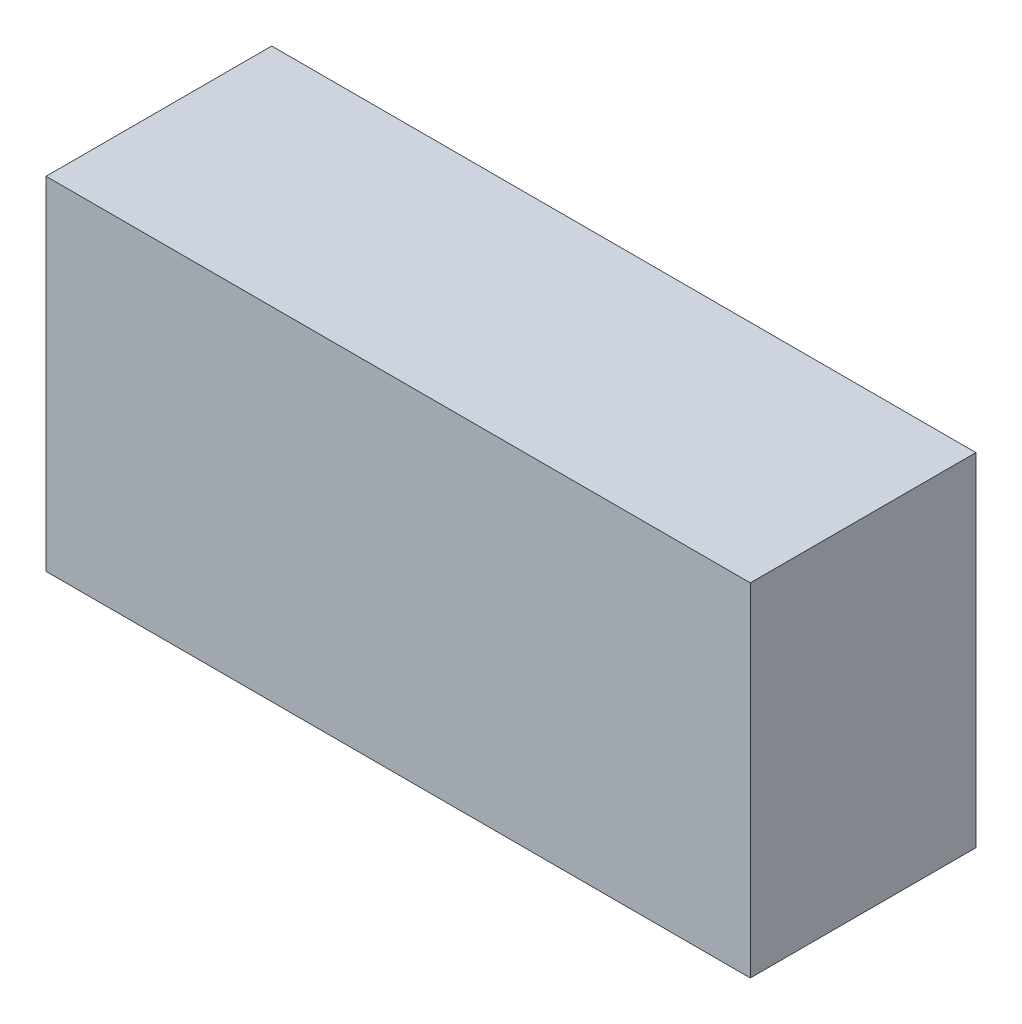
ISO-10303-21;
HEADER;
FILE_DESCRIPTION(('STEP AP214'),'2;1');
FILE_NAME('part.step','',(''),(''),'','','');
FILE_SCHEMA(('AUTOMOTIVE_DESIGN { 1 0 10303 214 1 1 1 1 }'));
ENDSEC;
DATA;
#1=APPLICATION_CONTEXT('core data for automotive mechanical design processes');
#2=APPLICATION_PROTOCOL_DEFINITION('international standard','automotive_design',2000,#1);
#3=PRODUCT_CONTEXT('',#1,'mechanical');
#4=PRODUCT('Part','Part','',(#3));
#5=PRODUCT_RELATED_PRODUCT_CATEGORY('part','',(#4));
#6=PRODUCT_DEFINITION_FORMATION('','',#4);
#7=PRODUCT_DEFINITION_CONTEXT('part definition',#1,'design');
#8=PRODUCT_DEFINITION('design','',#6,#7);
#9=PRODUCT_DEFINITION_SHAPE('','',#8);
#10=(LENGTH_UNIT() NAMED_UNIT(*) SI_UNIT(.MILLI.,.METRE.));
#11=(NAMED_UNIT(*) PLANE_ANGLE_UNIT() SI_UNIT($,.RADIAN.));
#12=(NAMED_UNIT(*) SI_UNIT($,.STERADIAN.) SOLID_ANGLE_UNIT());
#13=UNCERTAINTY_MEASURE_WITH_UNIT(LENGTH_MEASURE(1.E-05),#10,'distance_accuracy_value','');
#14=(GEOMETRIC_REPRESENTATION_CONTEXT(3) GLOBAL_UNCERTAINTY_ASSIGNED_CONTEXT((#13)) GLOBAL_UNIT_ASSIGNED_CONTEXT((#10,
#11,#12)) REPRESENTATION_CONTEXT('',''));
#15=CARTESIAN_POINT('',(0.,0.,0.));
#16=DIRECTION('',(0.,0.,1.));
#17=DIRECTION('',(1.,0.,0.));
#18=AXIS2_PLACEMENT_3D('',#15,#16,#17);
#19=CARTESIAN_POINT('',(0.,35.052,0.));
#20=DIRECTION('',(1.,0.,0.));
#21=DIRECTION('',(0.,0.,-1.));
#22=AXIS2_PLACEMENT_3D('',#19,#20,#21);
#23=PLANE('',#22);
#24=DIRECTION('',(0.,0.,1.));
#25=VECTOR('',#24,1.);
#26=CARTESIAN_POINT('',(0.,0.,0.));
#27=LINE('',#26,#25);
#28=CARTESIAN_POINT('',(0.,0.,-23.114));
#29=VERTEX_POINT('',#28);
#30=CARTESIAN_POINT('',(0.,0.,0.));
#31=VERTEX_POINT('',#30);
#32=EDGE_CURVE('E99',#29,#31,#27,.T.);
#33=ORIENTED_EDGE('',*,*,#32,.T.);
#34=DIRECTION('',(0.,-1.,0.));
#35=VECTOR('',#34,1.);
#36=CARTESIAN_POINT('',(0.,35.052,0.));
#37=LINE('',#36,#35);
#38=CARTESIAN_POINT('',(0.,35.052,0.));
#39=VERTEX_POINT('',#38);
#40=EDGE_CURVE('E11',#39,#31,#37,.T.);
#41=ORIENTED_EDGE('',*,*,#40,.F.);
#42=DIRECTION('',(0.,0.,1.));
#43=VECTOR('',#42,1.);
#44=CARTESIAN_POINT('',(0.,35.052,0.));
#45=LINE('',#44,#43);
#46=CARTESIAN_POINT('',(0.,35.052,-23.114));
#47=VERTEX_POINT('',#46);
#48=EDGE_CURVE('E87',#47,#39,#45,.T.);
#49=ORIENTED_EDGE('',*,*,#48,.F.);
#50=DIRECTION('',(0.,-1.,0.));
#51=VECTOR('',#50,1.);
#52=CARTESIAN_POINT('',(0.,35.052,-23.114));
#53=LINE('',#52,#51);
#54=EDGE_CURVE('E95',#47,#29,#53,.T.);
#55=ORIENTED_EDGE('',*,*,#54,.T.);
#56=EDGE_LOOP('',(#33,#41,#49,#55));
#57=FACE_BOUND('',#56,.T.);
#58=ADVANCED_FACE('F36',(#57),#23,.F.);
#59=CARTESIAN_POINT('',(0.,35.052,0.));
#60=DIRECTION('',(0.,0.,-1.));
#61=DIRECTION('',(-1.,0.,0.));
#62=AXIS2_PLACEMENT_3D('',#59,#60,#61);
#63=PLANE('',#62);
#64=DIRECTION('',(1.,0.,0.));
#65=VECTOR('',#64,1.);
#66=CARTESIAN_POINT('',(0.,0.,0.));
#67=LINE('',#66,#65);
#68=CARTESIAN_POINT('',(72.136,0.,0.));
#69=VERTEX_POINT('',#68);
#70=EDGE_CURVE('E91',#31,#69,#67,.T.);
#71=ORIENTED_EDGE('',*,*,#70,.T.);
#72=DIRECTION('',(0.,-1.,0.));
#73=VECTOR('',#72,1.);
#74=CARTESIAN_POINT('',(72.136,35.052,0.));
#75=LINE('',#74,#73);
#76=CARTESIAN_POINT('',(72.136,35.052,0.));
#77=VERTEX_POINT('',#76);
#78=EDGE_CURVE('E44',#77,#69,#75,.T.);
#79=ORIENTED_EDGE('',*,*,#78,.F.);
#80=DIRECTION('',(1.,0.,0.));
#81=VECTOR('',#80,1.);
#82=CARTESIAN_POINT('',(0.,35.052,0.));
#83=LINE('',#82,#81);
#84=EDGE_CURVE('E82',#39,#77,#83,.T.);
#85=ORIENTED_EDGE('',*,*,#84,.F.);
#86=ORIENTED_EDGE('',*,*,#40,.T.);
#87=EDGE_LOOP('',(#71,#79,#85,#86));
#88=FACE_BOUND('',#87,.T.);
#89=ADVANCED_FACE('F90',(#88),#63,.F.);
#90=CARTESIAN_POINT('',(72.136,35.052,0.));
#91=DIRECTION('',(-1.,0.,0.));
#92=DIRECTION('',(0.,0.,1.));
#93=AXIS2_PLACEMENT_3D('',#90,#91,#92);
#94=PLANE('',#93);
#95=DIRECTION('',(0.,0.,-1.));
#96=VECTOR('',#95,1.);
#97=CARTESIAN_POINT('',(72.136,0.,0.));
#98=LINE('',#97,#96);
#99=CARTESIAN_POINT('',(72.136,0.,-23.114));
#100=VERTEX_POINT('',#99);
#101=EDGE_CURVE('E69',#69,#100,#98,.T.);
#102=ORIENTED_EDGE('',*,*,#101,.T.);
#103=DIRECTION('',(0.,-1.,0.));
#104=VECTOR('',#103,1.);
#105=CARTESIAN_POINT('',(72.136,35.052,-23.114));
#106=LINE('',#105,#104);
#107=CARTESIAN_POINT('',(72.136,35.052,-23.114));
#108=VERTEX_POINT('',#107);
#109=EDGE_CURVE('E92',#108,#100,#106,.T.);
#110=ORIENTED_EDGE('',*,*,#109,.F.);
#111=DIRECTION('',(0.,0.,-1.));
#112=VECTOR('',#111,1.);
#113=CARTESIAN_POINT('',(72.136,35.052,0.));
#114=LINE('',#113,#112);
#115=EDGE_CURVE('E85',#77,#108,#114,.T.);
#116=ORIENTED_EDGE('',*,*,#115,.F.);
#117=ORIENTED_EDGE('',*,*,#78,.T.);
#118=EDGE_LOOP('',(#102,#110,#116,#117));
#119=FACE_BOUND('',#118,.T.);
#120=ADVANCED_FACE('F93',(#119),#94,.F.);
#121=CARTESIAN_POINT('',(0.,35.052,-23.114));
#122=DIRECTION('',(0.,0.,1.));
#123=DIRECTION('',(1.,0.,0.));
#124=AXIS2_PLACEMENT_3D('',#121,#122,#123);
#125=PLANE('',#124);
#126=DIRECTION('',(-1.,0.,0.));
#127=VECTOR('',#126,1.);
#128=CARTESIAN_POINT('',(0.,0.,-23.114));
#129=LINE('',#128,#127);
#130=EDGE_CURVE('E75',#100,#29,#129,.T.);
#131=ORIENTED_EDGE('',*,*,#130,.T.);
#132=ORIENTED_EDGE('',*,*,#54,.F.);
#133=DIRECTION('',(-1.,0.,0.));
#134=VECTOR('',#133,1.);
#135=CARTESIAN_POINT('',(0.,35.052,-23.114));
#136=LINE('',#135,#134);
#137=EDGE_CURVE('E52',#108,#47,#136,.T.);
#138=ORIENTED_EDGE('',*,*,#137,.F.);
#139=ORIENTED_EDGE('',*,*,#109,.T.);
#140=EDGE_LOOP('',(#131,#132,#138,#139));
#141=FACE_BOUND('',#140,.T.);
#142=ADVANCED_FACE('F106',(#141),#125,.F.);
#143=CARTESIAN_POINT('',(0.,35.052,0.));
#144=DIRECTION('',(0.,-1.,0.));
#145=DIRECTION('',(0.,0.,-1.));
#146=AXIS2_PLACEMENT_3D('',#143,#144,#145);
#147=PLANE('',#146);
#148=ORIENTED_EDGE('',*,*,#48,.T.);
#149=ORIENTED_EDGE('',*,*,#84,.T.);
#150=ORIENTED_EDGE('',*,*,#115,.T.);
#151=ORIENTED_EDGE('',*,*,#137,.T.);
#152=EDGE_LOOP('',(#148,#149,#150,#151));
#153=FACE_BOUND('',#152,.T.);
#154=ADVANCED_FACE('F83',(#153),#147,.F.);
#155=CARTESIAN_POINT('',(0.,0.,0.));
#156=DIRECTION('',(0.,-1.,0.));
#157=DIRECTION('',(0.,0.,-1.));
#158=AXIS2_PLACEMENT_3D('',#155,#156,#157);
#159=PLANE('',#158);
#160=ORIENTED_EDGE('',*,*,#32,.F.);
#161=ORIENTED_EDGE('',*,*,#130,.F.);
#162=ORIENTED_EDGE('',*,*,#101,.F.);
#163=ORIENTED_EDGE('',*,*,#70,.F.);
#164=EDGE_LOOP('',(#160,#161,#162,#163));
#165=FACE_BOUND('',#164,.T.);
#166=ADVANCED_FACE('F109',(#165),#159,.T.);
#167=CLOSED_SHELL('',(#58,#89,#120,#142,#154,#166));
#168=MANIFOLD_SOLID_BREP('B2',#167);
#169=ADVANCED_BREP_SHAPE_REPRESENTATION('',(#18,#168),#14);
#170=SHAPE_DEFINITION_REPRESENTATION(#9,#169);
ENDSEC;
END-ISO-10303-21;
